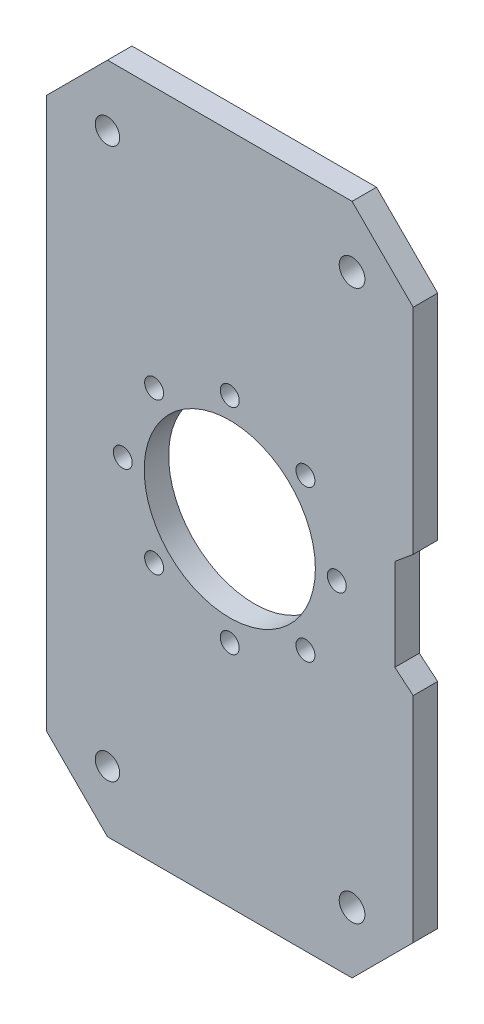
ISO-10303-21;
HEADER;
FILE_DESCRIPTION(('STEP AP214'),'2;1');
FILE_NAME('part.step','',(''),(''),'','','');
FILE_SCHEMA(('AUTOMOTIVE_DESIGN { 1 0 10303 214 1 1 1 1 }'));
ENDSEC;
DATA;
#1=APPLICATION_CONTEXT('core data for automotive mechanical design processes');
#2=APPLICATION_PROTOCOL_DEFINITION('international standard','automotive_design',2000,#1);
#3=PRODUCT_CONTEXT('',#1,'mechanical');
#4=PRODUCT('Part','Part','',(#3));
#5=PRODUCT_RELATED_PRODUCT_CATEGORY('part','',(#4));
#6=PRODUCT_DEFINITION_FORMATION('','',#4);
#7=PRODUCT_DEFINITION_CONTEXT('part definition',#1,'design');
#8=PRODUCT_DEFINITION('design','',#6,#7);
#9=PRODUCT_DEFINITION_SHAPE('','',#8);
#10=(LENGTH_UNIT() NAMED_UNIT(*) SI_UNIT(.MILLI.,.METRE.));
#11=(NAMED_UNIT(*) PLANE_ANGLE_UNIT() SI_UNIT($,.RADIAN.));
#12=(NAMED_UNIT(*) SI_UNIT($,.STERADIAN.) SOLID_ANGLE_UNIT());
#13=UNCERTAINTY_MEASURE_WITH_UNIT(LENGTH_MEASURE(1.E-05),#10,'distance_accuracy_value','');
#14=(GEOMETRIC_REPRESENTATION_CONTEXT(3) GLOBAL_UNCERTAINTY_ASSIGNED_CONTEXT((#13)) GLOBAL_UNIT_ASSIGNED_CONTEXT((#10,
#11,#12)) REPRESENTATION_CONTEXT('',''));
#15=CARTESIAN_POINT('',(0.,0.,0.));
#16=DIRECTION('',(0.,0.,1.));
#17=DIRECTION('',(1.,0.,0.));
#18=AXIS2_PLACEMENT_3D('',#15,#16,#17);
#19=CARTESIAN_POINT('',(30.,-55.,2.));
#20=DIRECTION('',(-1.,0.,0.));
#21=DIRECTION('',(0.,0.,1.));
#22=AXIS2_PLACEMENT_3D('',#19,#20,#21);
#23=PLANE('',#22);
#24=DIRECTION('',(0.,1.,0.));
#25=VECTOR('',#24,1.);
#26=CARTESIAN_POINT('',(30.,-55.,2.));
#27=LINE('',#26,#25);
#28=CARTESIAN_POINT('',(30.,10.,2.));
#29=VERTEX_POINT('',#28);
#30=CARTESIAN_POINT('',(30.,45.,2.));
#31=VERTEX_POINT('',#30);
#32=EDGE_CURVE('E249',#29,#31,#27,.T.);
#33=ORIENTED_EDGE('',*,*,#32,.F.);
#34=DIRECTION('',(0.,0.,-1.));
#35=VECTOR('',#34,1.);
#36=CARTESIAN_POINT('',(30.,10.,2.));
#37=LINE('',#36,#35);
#38=CARTESIAN_POINT('',(30.,10.,-2.));
#39=VERTEX_POINT('',#38);
#40=EDGE_CURVE('E158',#29,#39,#37,.T.);
#41=ORIENTED_EDGE('',*,*,#40,.T.);
#42=DIRECTION('',(0.,1.,0.));
#43=VECTOR('',#42,1.);
#44=CARTESIAN_POINT('',(30.,-55.,-2.));
#45=LINE('',#44,#43);
#46=CARTESIAN_POINT('',(30.,45.,-2.));
#47=VERTEX_POINT('',#46);
#48=EDGE_CURVE('E259',#39,#47,#45,.T.);
#49=ORIENTED_EDGE('',*,*,#48,.T.);
#50=DIRECTION('',(0.,0.,1.));
#51=VECTOR('',#50,1.);
#52=CARTESIAN_POINT('',(30.,45.,2.));
#53=LINE('',#52,#51);
#54=EDGE_CURVE('E290',#47,#31,#53,.T.);
#55=ORIENTED_EDGE('',*,*,#54,.T.);
#56=EDGE_LOOP('',(#33,#41,#49,#55));
#57=FACE_BOUND('',#56,.T.);
#58=ADVANCED_FACE('F37',(#57),#23,.F.);
#59=CARTESIAN_POINT('',(0.,0.,2.));
#60=DIRECTION('',(0.,0.,1.));
#61=DIRECTION('',(1.,0.,0.));
#62=AXIS2_PLACEMENT_3D('',#59,#60,#61);
#63=PLANE('',#62);
#64=DIRECTION('',(0.768221279597375,0.64018439966448,0.));
#65=VECTOR('',#64,1.);
#66=CARTESIAN_POINT('',(27.,7.5,2.));
#67=LINE('',#66,#65);
#68=CARTESIAN_POINT('',(27.,7.5,2.));
#69=VERTEX_POINT('',#68);
#70=EDGE_CURVE('E143',#69,#29,#67,.T.);
#71=ORIENTED_EDGE('',*,*,#70,.T.);
#72=ORIENTED_EDGE('',*,*,#32,.T.);
#73=DIRECTION('',(0.707106781186547,-0.707106781186549,0.));
#74=VECTOR('',#73,1.);
#75=CARTESIAN_POINT('',(37.5,37.4999999999999,2.));
#76=LINE('',#75,#74);
#77=CARTESIAN_POINT('',(20.,55.,2.));
#78=VERTEX_POINT('',#77);
#79=EDGE_CURVE('E284',#31,#78,#76,.F.);
#80=ORIENTED_EDGE('',*,*,#79,.T.);
#81=DIRECTION('',(-1.,0.,0.));
#82=VECTOR('',#81,1.);
#83=CARTESIAN_POINT('',(30.,55.,2.));
#84=LINE('',#83,#82);
#85=CARTESIAN_POINT('',(-20.,55.,2.));
#86=VERTEX_POINT('',#85);
#87=EDGE_CURVE('E251',#78,#86,#84,.T.);
#88=ORIENTED_EDGE('',*,*,#87,.T.);
#89=DIRECTION('',(0.707106781186549,0.707106781186547,0.));
#90=VECTOR('',#89,1.);
#91=CARTESIAN_POINT('',(-37.5,37.5000000000001,2.));
#92=LINE('',#91,#90);
#93=CARTESIAN_POINT('',(-30.,45.,2.));
#94=VERTEX_POINT('',#93);
#95=EDGE_CURVE('E282',#86,#94,#92,.F.);
#96=ORIENTED_EDGE('',*,*,#95,.T.);
#97=DIRECTION('',(0.,-1.,0.));
#98=VECTOR('',#97,1.);
#99=CARTESIAN_POINT('',(-30.,-55.,2.));
#100=LINE('',#99,#98);
#101=CARTESIAN_POINT('',(-30.,-45.,2.));
#102=VERTEX_POINT('',#101);
#103=EDGE_CURVE('E242',#94,#102,#100,.T.);
#104=ORIENTED_EDGE('',*,*,#103,.T.);
#105=DIRECTION('',(-0.707106781186547,0.707106781186549,0.));
#106=VECTOR('',#105,1.);
#107=CARTESIAN_POINT('',(-37.5,-37.4999999999999,2.));
#108=LINE('',#107,#106);
#109=CARTESIAN_POINT('',(-20.,-55.,2.));
#110=VERTEX_POINT('',#109);
#111=EDGE_CURVE('E288',#102,#110,#108,.F.);
#112=ORIENTED_EDGE('',*,*,#111,.T.);
#113=DIRECTION('',(1.,0.,0.));
#114=VECTOR('',#113,1.);
#115=CARTESIAN_POINT('',(30.,-55.,2.));
#116=LINE('',#115,#114);
#117=CARTESIAN_POINT('',(20.,-55.,2.));
#118=VERTEX_POINT('',#117);
#119=EDGE_CURVE('E245',#110,#118,#116,.T.);
#120=ORIENTED_EDGE('',*,*,#119,.T.);
#121=DIRECTION('',(-0.707106781186549,-0.707106781186547,0.));
#122=VECTOR('',#121,1.);
#123=CARTESIAN_POINT('',(37.5,-37.5000000000001,2.));
#124=LINE('',#123,#122);
#125=CARTESIAN_POINT('',(30.,-45.,2.));
#126=VERTEX_POINT('',#125);
#127=EDGE_CURVE('E286',#118,#126,#124,.F.);
#128=ORIENTED_EDGE('',*,*,#127,.T.);
#129=CARTESIAN_POINT('',(30.,-10.,2.));
#130=VERTEX_POINT('',#129);
#131=EDGE_CURVE('E149',#126,#130,#27,.T.);
#132=ORIENTED_EDGE('',*,*,#131,.T.);
#133=DIRECTION('',(-0.768221279597375,0.64018439966448,0.));
#134=VECTOR('',#133,1.);
#135=CARTESIAN_POINT('',(30.,-10.,2.));
#136=LINE('',#135,#134);
#137=CARTESIAN_POINT('',(27.,-7.5,2.));
#138=VERTEX_POINT('',#137);
#139=EDGE_CURVE('E53',#130,#138,#136,.T.);
#140=ORIENTED_EDGE('',*,*,#139,.T.);
#141=DIRECTION('',(0.,1.,0.));
#142=VECTOR('',#141,1.);
#143=CARTESIAN_POINT('',(27.,-7.5,2.));
#144=LINE('',#143,#142);
#145=EDGE_CURVE('E138',#138,#69,#144,.T.);
#146=ORIENTED_EDGE('',*,*,#145,.T.);
#147=EDGE_LOOP('',(#71,#72,#80,#88,#96,#104,#112,#120,#128,#132,#140,#146));
#148=FACE_BOUND('',#147,.T.);
#149=CARTESIAN_POINT('',(-17.5,0.,2.));
#150=DIRECTION('',(0.,0.,1.));
#151=DIRECTION('',(1.,0.,0.));
#152=AXIS2_PLACEMENT_3D('',#149,#150,#151);
#153=CIRCLE('',#152,1.55);
#154=CARTESIAN_POINT('',(-15.95,0.,2.));
#155=VERTEX_POINT('',#154);
#156=EDGE_CURVE('E170',#155,#155,#153,.T.);
#157=ORIENTED_EDGE('',*,*,#156,.F.);
#158=EDGE_LOOP('',(#157));
#159=FACE_BOUND('',#158,.T.);
#160=CARTESIAN_POINT('',(0.,-17.5,2.));
#161=DIRECTION('',(0.,0.,1.));
#162=DIRECTION('',(1.,0.,0.));
#163=AXIS2_PLACEMENT_3D('',#160,#161,#162);
#164=CIRCLE('',#163,1.55);
#165=CARTESIAN_POINT('',(1.55,-17.5,2.));
#166=VERTEX_POINT('',#165);
#167=EDGE_CURVE('E182',#166,#166,#164,.T.);
#168=ORIENTED_EDGE('',*,*,#167,.F.);
#169=EDGE_LOOP('',(#168));
#170=FACE_BOUND('',#169,.T.);
#171=CARTESIAN_POINT('',(17.5,0.,2.));
#172=DIRECTION('',(0.,0.,1.));
#173=DIRECTION('',(1.,0.,0.));
#174=AXIS2_PLACEMENT_3D('',#171,#172,#173);
#175=CIRCLE('',#174,1.55);
#176=CARTESIAN_POINT('',(19.05,0.,2.));
#177=VERTEX_POINT('',#176);
#178=EDGE_CURVE('E194',#177,#177,#175,.T.);
#179=ORIENTED_EDGE('',*,*,#178,.F.);
#180=EDGE_LOOP('',(#179));
#181=FACE_BOUND('',#180,.T.);
#182=CARTESIAN_POINT('',(0.,17.5,2.));
#183=DIRECTION('',(0.,0.,1.));
#184=DIRECTION('',(1.,0.,0.));
#185=AXIS2_PLACEMENT_3D('',#182,#183,#184);
#186=CIRCLE('',#185,1.55);
#187=CARTESIAN_POINT('',(1.55,17.5,2.));
#188=VERTEX_POINT('',#187);
#189=EDGE_CURVE('E206',#188,#188,#186,.T.);
#190=ORIENTED_EDGE('',*,*,#189,.F.);
#191=EDGE_LOOP('',(#190));
#192=FACE_BOUND('',#191,.T.);
#193=CARTESIAN_POINT('',(-20.,-45.,2.));
#194=DIRECTION('',(0.,0.,1.));
#195=DIRECTION('',(1.,0.,0.));
#196=AXIS2_PLACEMENT_3D('',#193,#194,#195);
#197=CIRCLE('',#196,2.);
#198=CARTESIAN_POINT('',(-18.,-45.,2.));
#199=VERTEX_POINT('',#198);
#200=EDGE_CURVE('E218',#199,#199,#197,.T.);
#201=ORIENTED_EDGE('',*,*,#200,.F.);
#202=EDGE_LOOP('',(#201));
#203=FACE_BOUND('',#202,.T.);
#204=CARTESIAN_POINT('',(-20.,45.,2.));
#205=DIRECTION('',(0.,0.,1.));
#206=DIRECTION('',(1.,0.,0.));
#207=AXIS2_PLACEMENT_3D('',#204,#205,#206);
#208=CIRCLE('',#207,2.);
#209=CARTESIAN_POINT('',(-18.,45.,2.));
#210=VERTEX_POINT('',#209);
#211=EDGE_CURVE('E230',#210,#210,#208,.T.);
#212=ORIENTED_EDGE('',*,*,#211,.F.);
#213=EDGE_LOOP('',(#212));
#214=FACE_BOUND('',#213,.T.);
#215=CARTESIAN_POINT('',(0.,0.,2.));
#216=DIRECTION('',(0.,0.,1.));
#217=DIRECTION('',(1.,0.,0.));
#218=AXIS2_PLACEMENT_3D('',#215,#216,#217);
#219=CIRCLE('',#218,14.);
#220=CARTESIAN_POINT('',(14.,0.,2.));
#221=VERTEX_POINT('',#220);
#222=EDGE_CURVE('E236',#221,#221,#219,.T.);
#223=ORIENTED_EDGE('',*,*,#222,.F.);
#224=EDGE_LOOP('',(#223));
#225=FACE_BOUND('',#224,.T.);
#226=CARTESIAN_POINT('',(20.,45.,2.));
#227=DIRECTION('',(0.,0.,1.));
#228=DIRECTION('',(1.,0.,0.));
#229=AXIS2_PLACEMENT_3D('',#226,#227,#228);
#230=CIRCLE('',#229,2.1);
#231=CARTESIAN_POINT('',(22.1,45.,2.));
#232=VERTEX_POINT('',#231);
#233=EDGE_CURVE('E224',#232,#232,#230,.T.);
#234=ORIENTED_EDGE('',*,*,#233,.F.);
#235=EDGE_LOOP('',(#234));
#236=FACE_BOUND('',#235,.T.);
#237=CARTESIAN_POINT('',(20.,-45.,2.));
#238=DIRECTION('',(0.,0.,1.));
#239=DIRECTION('',(1.,0.,0.));
#240=AXIS2_PLACEMENT_3D('',#237,#238,#239);
#241=CIRCLE('',#240,2.1);
#242=CARTESIAN_POINT('',(22.1,-45.,2.));
#243=VERTEX_POINT('',#242);
#244=EDGE_CURVE('E212',#243,#243,#241,.T.);
#245=ORIENTED_EDGE('',*,*,#244,.F.);
#246=EDGE_LOOP('',(#245));
#247=FACE_BOUND('',#246,.T.);
#248=CARTESIAN_POINT('',(12.3743686707646,12.3743686707646,2.));
#249=DIRECTION('',(0.,0.,1.));
#250=DIRECTION('',(1.,0.,0.));
#251=AXIS2_PLACEMENT_3D('',#248,#249,#250);
#252=CIRCLE('',#251,1.55);
#253=CARTESIAN_POINT('',(13.9243686707646,12.3743686707646,2.));
#254=VERTEX_POINT('',#253);
#255=EDGE_CURVE('E200',#254,#254,#252,.T.);
#256=ORIENTED_EDGE('',*,*,#255,.F.);
#257=EDGE_LOOP('',(#256));
#258=FACE_BOUND('',#257,.T.);
#259=CARTESIAN_POINT('',(12.3743686707646,-12.3743686707646,2.));
#260=DIRECTION('',(0.,0.,1.));
#261=DIRECTION('',(1.,0.,0.));
#262=AXIS2_PLACEMENT_3D('',#259,#260,#261);
#263=CIRCLE('',#262,1.55);
#264=CARTESIAN_POINT('',(13.9243686707646,-12.3743686707646,2.));
#265=VERTEX_POINT('',#264);
#266=EDGE_CURVE('E188',#265,#265,#263,.T.);
#267=ORIENTED_EDGE('',*,*,#266,.F.);
#268=EDGE_LOOP('',(#267));
#269=FACE_BOUND('',#268,.T.);
#270=CARTESIAN_POINT('',(-12.3743686707646,-12.3743686707646,2.));
#271=DIRECTION('',(0.,0.,1.));
#272=DIRECTION('',(1.,0.,0.));
#273=AXIS2_PLACEMENT_3D('',#270,#271,#272);
#274=CIRCLE('',#273,1.55);
#275=CARTESIAN_POINT('',(-10.8243686707646,-12.3743686707646,2.));
#276=VERTEX_POINT('',#275);
#277=EDGE_CURVE('E176',#276,#276,#274,.T.);
#278=ORIENTED_EDGE('',*,*,#277,.F.);
#279=EDGE_LOOP('',(#278));
#280=FACE_BOUND('',#279,.T.);
#281=CARTESIAN_POINT('',(-12.3743686707646,12.3743686707646,2.));
#282=DIRECTION('',(0.,0.,1.));
#283=DIRECTION('',(1.,0.,0.));
#284=AXIS2_PLACEMENT_3D('',#281,#282,#283);
#285=CIRCLE('',#284,1.55);
#286=CARTESIAN_POINT('',(-10.8243686707646,12.3743686707646,2.));
#287=VERTEX_POINT('',#286);
#288=EDGE_CURVE('E164',#287,#287,#285,.T.);
#289=ORIENTED_EDGE('',*,*,#288,.F.);
#290=EDGE_LOOP('',(#289));
#291=FACE_BOUND('',#290,.T.);
#292=ADVANCED_FACE('F146',(#148,#159,#170,#181,#192,#203,#214,#225,#236,#247,#258,#269,#280,
#291),#63,.T.);
#293=CARTESIAN_POINT('',(0.,0.,-2.));
#294=DIRECTION('',(0.,0.,1.));
#295=DIRECTION('',(1.,0.,0.));
#296=AXIS2_PLACEMENT_3D('',#293,#294,#295);
#297=PLANE('',#296);
#298=ORIENTED_EDGE('',*,*,#48,.F.);
#299=DIRECTION('',(0.768221279597375,0.64018439966448,0.));
#300=VECTOR('',#299,1.);
#301=CARTESIAN_POINT('',(27.,7.5,-2.));
#302=LINE('',#301,#300);
#303=CARTESIAN_POINT('',(27.,7.5,-2.));
#304=VERTEX_POINT('',#303);
#305=EDGE_CURVE('E150',#304,#39,#302,.T.);
#306=ORIENTED_EDGE('',*,*,#305,.F.);
#307=DIRECTION('',(0.,1.,0.));
#308=VECTOR('',#307,1.);
#309=CARTESIAN_POINT('',(27.,-7.5,-2.));
#310=LINE('',#309,#308);
#311=CARTESIAN_POINT('',(27.,-7.5,-2.));
#312=VERTEX_POINT('',#311);
#313=EDGE_CURVE('E152',#312,#304,#310,.T.);
#314=ORIENTED_EDGE('',*,*,#313,.F.);
#315=DIRECTION('',(-0.768221279597375,0.64018439966448,0.));
#316=VECTOR('',#315,1.);
#317=CARTESIAN_POINT('',(30.,-10.,-2.));
#318=LINE('',#317,#316);
#319=CARTESIAN_POINT('',(30.,-10.,-2.));
#320=VERTEX_POINT('',#319);
#321=EDGE_CURVE('E130',#320,#312,#318,.T.);
#322=ORIENTED_EDGE('',*,*,#321,.F.);
#323=CARTESIAN_POINT('',(30.,-45.,-2.));
#324=VERTEX_POINT('',#323);
#325=EDGE_CURVE('E260',#324,#320,#45,.T.);
#326=ORIENTED_EDGE('',*,*,#325,.F.);
#327=DIRECTION('',(0.707106781186549,0.707106781186547,0.));
#328=VECTOR('',#327,1.);
#329=CARTESIAN_POINT('',(30.,-45.,-2.));
#330=LINE('',#329,#328);
#331=CARTESIAN_POINT('',(20.,-55.,-2.));
#332=VERTEX_POINT('',#331);
#333=EDGE_CURVE('E273',#324,#332,#330,.F.);
#334=ORIENTED_EDGE('',*,*,#333,.T.);
#335=DIRECTION('',(1.,0.,0.));
#336=VECTOR('',#335,1.);
#337=CARTESIAN_POINT('',(30.,-55.,-2.));
#338=LINE('',#337,#336);
#339=CARTESIAN_POINT('',(-20.,-55.,-2.));
#340=VERTEX_POINT('',#339);
#341=EDGE_CURVE('E256',#340,#332,#338,.T.);
#342=ORIENTED_EDGE('',*,*,#341,.F.);
#343=DIRECTION('',(0.707106781186547,-0.707106781186549,0.));
#344=VECTOR('',#343,1.);
#345=CARTESIAN_POINT('',(-20.,-55.,-2.));
#346=LINE('',#345,#344);
#347=CARTESIAN_POINT('',(-30.,-45.,-2.));
#348=VERTEX_POINT('',#347);
#349=EDGE_CURVE('E275',#340,#348,#346,.F.);
#350=ORIENTED_EDGE('',*,*,#349,.T.);
#351=DIRECTION('',(0.,-1.,0.));
#352=VECTOR('',#351,1.);
#353=CARTESIAN_POINT('',(-30.,-55.,-2.));
#354=LINE('',#353,#352);
#355=CARTESIAN_POINT('',(-30.,45.,-2.));
#356=VERTEX_POINT('',#355);
#357=EDGE_CURVE('E239',#356,#348,#354,.T.);
#358=ORIENTED_EDGE('',*,*,#357,.F.);
#359=DIRECTION('',(-0.707106781186549,-0.707106781186547,0.));
#360=VECTOR('',#359,1.);
#361=CARTESIAN_POINT('',(-30.,45.,-2.));
#362=LINE('',#361,#360);
#363=CARTESIAN_POINT('',(-20.,55.,-2.));
#364=VERTEX_POINT('',#363);
#365=EDGE_CURVE('E268',#356,#364,#362,.F.);
#366=ORIENTED_EDGE('',*,*,#365,.T.);
#367=DIRECTION('',(-1.,0.,0.));
#368=VECTOR('',#367,1.);
#369=CARTESIAN_POINT('',(30.,55.,-2.));
#370=LINE('',#369,#368);
#371=CARTESIAN_POINT('',(20.,55.,-2.));
#372=VERTEX_POINT('',#371);
#373=EDGE_CURVE('E246',#372,#364,#370,.T.);
#374=ORIENTED_EDGE('',*,*,#373,.F.);
#375=DIRECTION('',(-0.707106781186547,0.707106781186549,0.));
#376=VECTOR('',#375,1.);
#377=CARTESIAN_POINT('',(20.,55.,-2.));
#378=LINE('',#377,#376);
#379=EDGE_CURVE('E270',#372,#47,#378,.F.);
#380=ORIENTED_EDGE('',*,*,#379,.T.);
#381=EDGE_LOOP('',(#298,#306,#314,#322,#326,#334,#342,#350,#358,#366,#374,#380));
#382=FACE_BOUND('',#381,.T.);
#383=CARTESIAN_POINT('',(0.,0.,-2.));
#384=DIRECTION('',(0.,0.,1.));
#385=DIRECTION('',(1.,0.,0.));
#386=AXIS2_PLACEMENT_3D('',#383,#384,#385);
#387=CIRCLE('',#386,14.);
#388=CARTESIAN_POINT('',(14.,0.,-2.));
#389=VERTEX_POINT('',#388);
#390=EDGE_CURVE('E233',#389,#389,#387,.T.);
#391=ORIENTED_EDGE('',*,*,#390,.T.);
#392=EDGE_LOOP('',(#391));
#393=FACE_BOUND('',#392,.T.);
#394=CARTESIAN_POINT('',(-20.,45.,-2.));
#395=DIRECTION('',(0.,0.,1.));
#396=DIRECTION('',(1.,0.,0.));
#397=AXIS2_PLACEMENT_3D('',#394,#395,#396);
#398=CIRCLE('',#397,2.);
#399=CARTESIAN_POINT('',(-18.,45.,-2.));
#400=VERTEX_POINT('',#399);
#401=EDGE_CURVE('E227',#400,#400,#398,.T.);
#402=ORIENTED_EDGE('',*,*,#401,.T.);
#403=EDGE_LOOP('',(#402));
#404=FACE_BOUND('',#403,.T.);
#405=CARTESIAN_POINT('',(20.,45.,-2.));
#406=DIRECTION('',(0.,0.,1.));
#407=DIRECTION('',(1.,0.,0.));
#408=AXIS2_PLACEMENT_3D('',#405,#406,#407);
#409=CIRCLE('',#408,2.1);
#410=CARTESIAN_POINT('',(22.1,45.,-2.));
#411=VERTEX_POINT('',#410);
#412=EDGE_CURVE('E221',#411,#411,#409,.T.);
#413=ORIENTED_EDGE('',*,*,#412,.T.);
#414=EDGE_LOOP('',(#413));
#415=FACE_BOUND('',#414,.T.);
#416=CARTESIAN_POINT('',(-20.,-45.,-2.));
#417=DIRECTION('',(0.,0.,1.));
#418=DIRECTION('',(1.,0.,0.));
#419=AXIS2_PLACEMENT_3D('',#416,#417,#418);
#420=CIRCLE('',#419,2.);
#421=CARTESIAN_POINT('',(-18.,-45.,-2.));
#422=VERTEX_POINT('',#421);
#423=EDGE_CURVE('E215',#422,#422,#420,.T.);
#424=ORIENTED_EDGE('',*,*,#423,.T.);
#425=EDGE_LOOP('',(#424));
#426=FACE_BOUND('',#425,.T.);
#427=CARTESIAN_POINT('',(20.,-45.,-2.));
#428=DIRECTION('',(0.,0.,1.));
#429=DIRECTION('',(1.,0.,0.));
#430=AXIS2_PLACEMENT_3D('',#427,#428,#429);
#431=CIRCLE('',#430,2.1);
#432=CARTESIAN_POINT('',(22.1,-45.,-2.));
#433=VERTEX_POINT('',#432);
#434=EDGE_CURVE('E209',#433,#433,#431,.T.);
#435=ORIENTED_EDGE('',*,*,#434,.T.);
#436=EDGE_LOOP('',(#435));
#437=FACE_BOUND('',#436,.T.);
#438=CARTESIAN_POINT('',(0.,17.5,-2.));
#439=DIRECTION('',(0.,0.,1.));
#440=DIRECTION('',(1.,0.,0.));
#441=AXIS2_PLACEMENT_3D('',#438,#439,#440);
#442=CIRCLE('',#441,1.55);
#443=CARTESIAN_POINT('',(1.55,17.5,-2.));
#444=VERTEX_POINT('',#443);
#445=EDGE_CURVE('E203',#444,#444,#442,.T.);
#446=ORIENTED_EDGE('',*,*,#445,.T.);
#447=EDGE_LOOP('',(#446));
#448=FACE_BOUND('',#447,.T.);
#449=CARTESIAN_POINT('',(12.3743686707646,12.3743686707646,-2.));
#450=DIRECTION('',(0.,0.,1.));
#451=DIRECTION('',(1.,0.,0.));
#452=AXIS2_PLACEMENT_3D('',#449,#450,#451);
#453=CIRCLE('',#452,1.55);
#454=CARTESIAN_POINT('',(13.9243686707646,12.3743686707646,-2.));
#455=VERTEX_POINT('',#454);
#456=EDGE_CURVE('E197',#455,#455,#453,.T.);
#457=ORIENTED_EDGE('',*,*,#456,.T.);
#458=EDGE_LOOP('',(#457));
#459=FACE_BOUND('',#458,.T.);
#460=CARTESIAN_POINT('',(17.5,0.,-2.));
#461=DIRECTION('',(0.,0.,1.));
#462=DIRECTION('',(1.,0.,0.));
#463=AXIS2_PLACEMENT_3D('',#460,#461,#462);
#464=CIRCLE('',#463,1.55);
#465=CARTESIAN_POINT('',(19.05,0.,-2.));
#466=VERTEX_POINT('',#465);
#467=EDGE_CURVE('E191',#466,#466,#464,.T.);
#468=ORIENTED_EDGE('',*,*,#467,.T.);
#469=EDGE_LOOP('',(#468));
#470=FACE_BOUND('',#469,.T.);
#471=CARTESIAN_POINT('',(12.3743686707646,-12.3743686707646,-2.));
#472=DIRECTION('',(0.,0.,1.));
#473=DIRECTION('',(1.,0.,0.));
#474=AXIS2_PLACEMENT_3D('',#471,#472,#473);
#475=CIRCLE('',#474,1.55);
#476=CARTESIAN_POINT('',(13.9243686707646,-12.3743686707646,-2.));
#477=VERTEX_POINT('',#476);
#478=EDGE_CURVE('E185',#477,#477,#475,.T.);
#479=ORIENTED_EDGE('',*,*,#478,.T.);
#480=EDGE_LOOP('',(#479));
#481=FACE_BOUND('',#480,.T.);
#482=CARTESIAN_POINT('',(0.,-17.5,-2.));
#483=DIRECTION('',(0.,0.,1.));
#484=DIRECTION('',(1.,0.,0.));
#485=AXIS2_PLACEMENT_3D('',#482,#483,#484);
#486=CIRCLE('',#485,1.55);
#487=CARTESIAN_POINT('',(1.55,-17.5,-2.));
#488=VERTEX_POINT('',#487);
#489=EDGE_CURVE('E179',#488,#488,#486,.T.);
#490=ORIENTED_EDGE('',*,*,#489,.T.);
#491=EDGE_LOOP('',(#490));
#492=FACE_BOUND('',#491,.T.);
#493=CARTESIAN_POINT('',(-12.3743686707646,-12.3743686707646,-2.));
#494=DIRECTION('',(0.,0.,1.));
#495=DIRECTION('',(1.,0.,0.));
#496=AXIS2_PLACEMENT_3D('',#493,#494,#495);
#497=CIRCLE('',#496,1.55);
#498=CARTESIAN_POINT('',(-10.8243686707646,-12.3743686707646,-2.));
#499=VERTEX_POINT('',#498);
#500=EDGE_CURVE('E173',#499,#499,#497,.T.);
#501=ORIENTED_EDGE('',*,*,#500,.T.);
#502=EDGE_LOOP('',(#501));
#503=FACE_BOUND('',#502,.T.);
#504=CARTESIAN_POINT('',(-17.5,0.,-2.));
#505=DIRECTION('',(0.,0.,1.));
#506=DIRECTION('',(1.,0.,0.));
#507=AXIS2_PLACEMENT_3D('',#504,#505,#506);
#508=CIRCLE('',#507,1.55);
#509=CARTESIAN_POINT('',(-15.95,0.,-2.));
#510=VERTEX_POINT('',#509);
#511=EDGE_CURVE('E167',#510,#510,#508,.T.);
#512=ORIENTED_EDGE('',*,*,#511,.T.);
#513=EDGE_LOOP('',(#512));
#514=FACE_BOUND('',#513,.T.);
#515=CARTESIAN_POINT('',(-12.3743686707646,12.3743686707646,-2.));
#516=DIRECTION('',(0.,0.,1.));
#517=DIRECTION('',(1.,0.,0.));
#518=AXIS2_PLACEMENT_3D('',#515,#516,#517);
#519=CIRCLE('',#518,1.55);
#520=CARTESIAN_POINT('',(-10.8243686707646,12.3743686707646,-2.));
#521=VERTEX_POINT('',#520);
#522=EDGE_CURVE('E161',#521,#521,#519,.T.);
#523=ORIENTED_EDGE('',*,*,#522,.T.);
#524=EDGE_LOOP('',(#523));
#525=FACE_BOUND('',#524,.T.);
#526=ADVANCED_FACE('F303',(#382,#393,#404,#415,#426,#437,#448,#459,#470,#481,#492,#503,#514,
#525),#297,.F.);
#527=CARTESIAN_POINT('',(-30.,-55.,2.));
#528=DIRECTION('',(1.,0.,0.));
#529=DIRECTION('',(0.,0.,-1.));
#530=AXIS2_PLACEMENT_3D('',#527,#528,#529);
#531=PLANE('',#530);
#532=ORIENTED_EDGE('',*,*,#357,.T.);
#533=DIRECTION('',(0.,0.,1.));
#534=VECTOR('',#533,1.);
#535=CARTESIAN_POINT('',(-30.,-45.,2.));
#536=LINE('',#535,#534);
#537=EDGE_CURVE('E280',#348,#102,#536,.T.);
#538=ORIENTED_EDGE('',*,*,#537,.T.);
#539=ORIENTED_EDGE('',*,*,#103,.F.);
#540=DIRECTION('',(0.,0.,-1.));
#541=VECTOR('',#540,1.);
#542=CARTESIAN_POINT('',(-30.,45.,2.));
#543=LINE('',#542,#541);
#544=EDGE_CURVE('E277',#94,#356,#543,.T.);
#545=ORIENTED_EDGE('',*,*,#544,.T.);
#546=EDGE_LOOP('',(#532,#538,#539,#545));
#547=FACE_BOUND('',#546,.T.);
#548=ADVANCED_FACE('F325',(#547),#531,.F.);
#549=CARTESIAN_POINT('',(30.,-55.,2.));
#550=DIRECTION('',(0.,1.,0.));
#551=DIRECTION('',(0.,0.,1.));
#552=AXIS2_PLACEMENT_3D('',#549,#550,#551);
#553=PLANE('',#552);
#554=ORIENTED_EDGE('',*,*,#119,.F.);
#555=DIRECTION('',(0.,0.,-1.));
#556=VECTOR('',#555,1.);
#557=CARTESIAN_POINT('',(-20.,-55.,2.));
#558=LINE('',#557,#556);
#559=EDGE_CURVE('E265',#110,#340,#558,.T.);
#560=ORIENTED_EDGE('',*,*,#559,.T.);
#561=ORIENTED_EDGE('',*,*,#341,.T.);
#562=DIRECTION('',(0.,0.,1.));
#563=VECTOR('',#562,1.);
#564=CARTESIAN_POINT('',(20.,-55.,2.));
#565=LINE('',#564,#563);
#566=EDGE_CURVE('E253',#332,#118,#565,.T.);
#567=ORIENTED_EDGE('',*,*,#566,.T.);
#568=EDGE_LOOP('',(#554,#560,#561,#567));
#569=FACE_BOUND('',#568,.T.);
#570=ADVANCED_FACE('F332',(#569),#553,.F.);
#571=ORIENTED_EDGE('',*,*,#325,.T.);
#572=DIRECTION('',(0.,0.,-1.));
#573=VECTOR('',#572,1.);
#574=CARTESIAN_POINT('',(30.,-10.,2.));
#575=LINE('',#574,#573);
#576=EDGE_CURVE('E135',#130,#320,#575,.T.);
#577=ORIENTED_EDGE('',*,*,#576,.F.);
#578=ORIENTED_EDGE('',*,*,#131,.F.);
#579=DIRECTION('',(0.,0.,-1.));
#580=VECTOR('',#579,1.);
#581=CARTESIAN_POINT('',(30.,-45.,2.));
#582=LINE('',#581,#580);
#583=EDGE_CURVE('E293',#126,#324,#582,.T.);
#584=ORIENTED_EDGE('',*,*,#583,.T.);
#585=EDGE_LOOP('',(#571,#577,#578,#584));
#586=FACE_BOUND('',#585,.T.);
#587=ADVANCED_FACE('F298',(#586),#23,.F.);
#588=CARTESIAN_POINT('',(30.,55.,2.));
#589=DIRECTION('',(0.,-1.,0.));
#590=DIRECTION('',(0.,0.,-1.));
#591=AXIS2_PLACEMENT_3D('',#588,#589,#590);
#592=PLANE('',#591);
#593=ORIENTED_EDGE('',*,*,#87,.F.);
#594=DIRECTION('',(0.,0.,-1.));
#595=VECTOR('',#594,1.);
#596=CARTESIAN_POINT('',(20.,55.,2.));
#597=LINE('',#596,#595);
#598=EDGE_CURVE('E11',#78,#372,#597,.T.);
#599=ORIENTED_EDGE('',*,*,#598,.T.);
#600=ORIENTED_EDGE('',*,*,#373,.T.);
#601=DIRECTION('',(0.,0.,1.));
#602=VECTOR('',#601,1.);
#603=CARTESIAN_POINT('',(-20.,55.,2.));
#604=LINE('',#603,#602);
#605=EDGE_CURVE('E46',#364,#86,#604,.T.);
#606=ORIENTED_EDGE('',*,*,#605,.T.);
#607=EDGE_LOOP('',(#593,#599,#600,#606));
#608=FACE_BOUND('',#607,.T.);
#609=ADVANCED_FACE('F316',(#608),#592,.F.);
#610=CARTESIAN_POINT('',(0.,0.,2.));
#611=DIRECTION('',(0.,0.,-1.));
#612=DIRECTION('',(-1.,0.,0.));
#613=AXIS2_PLACEMENT_3D('',#610,#611,#612);
#614=CYLINDRICAL_SURFACE('',#613,14.);
#615=ORIENTED_EDGE('',*,*,#222,.T.);
#616=EDGE_LOOP('',(#615));
#617=FACE_BOUND('',#616,.T.);
#618=ORIENTED_EDGE('',*,*,#390,.F.);
#619=EDGE_LOOP('',(#618));
#620=FACE_BOUND('',#619,.T.);
#621=ADVANCED_FACE('F357',(#617,#620),#614,.F.);
#622=CARTESIAN_POINT('',(-20.,45.,2.));
#623=DIRECTION('',(0.,0.,-1.));
#624=DIRECTION('',(-1.,0.,0.));
#625=AXIS2_PLACEMENT_3D('',#622,#623,#624);
#626=CYLINDRICAL_SURFACE('',#625,2.);
#627=ORIENTED_EDGE('',*,*,#211,.T.);
#628=EDGE_LOOP('',(#627));
#629=FACE_BOUND('',#628,.T.);
#630=ORIENTED_EDGE('',*,*,#401,.F.);
#631=EDGE_LOOP('',(#630));
#632=FACE_BOUND('',#631,.T.);
#633=ADVANCED_FACE('F381',(#629,#632),#626,.F.);
#634=CARTESIAN_POINT('',(20.,45.,2.));
#635=DIRECTION('',(0.,0.,-1.));
#636=DIRECTION('',(-1.,0.,0.));
#637=AXIS2_PLACEMENT_3D('',#634,#635,#636);
#638=CYLINDRICAL_SURFACE('',#637,2.1);
#639=ORIENTED_EDGE('',*,*,#233,.T.);
#640=EDGE_LOOP('',(#639));
#641=FACE_BOUND('',#640,.T.);
#642=ORIENTED_EDGE('',*,*,#412,.F.);
#643=EDGE_LOOP('',(#642));
#644=FACE_BOUND('',#643,.T.);
#645=ADVANCED_FACE('F385',(#641,#644),#638,.F.);
#646=CARTESIAN_POINT('',(-20.,-45.,2.));
#647=DIRECTION('',(0.,0.,-1.));
#648=DIRECTION('',(-1.,0.,0.));
#649=AXIS2_PLACEMENT_3D('',#646,#647,#648);
#650=CYLINDRICAL_SURFACE('',#649,2.);
#651=ORIENTED_EDGE('',*,*,#200,.T.);
#652=EDGE_LOOP('',(#651));
#653=FACE_BOUND('',#652,.T.);
#654=ORIENTED_EDGE('',*,*,#423,.F.);
#655=EDGE_LOOP('',(#654));
#656=FACE_BOUND('',#655,.T.);
#657=ADVANCED_FACE('F389',(#653,#656),#650,.F.);
#658=CARTESIAN_POINT('',(20.,-45.,2.));
#659=DIRECTION('',(0.,0.,-1.));
#660=DIRECTION('',(-1.,0.,0.));
#661=AXIS2_PLACEMENT_3D('',#658,#659,#660);
#662=CYLINDRICAL_SURFACE('',#661,2.1);
#663=ORIENTED_EDGE('',*,*,#244,.T.);
#664=EDGE_LOOP('',(#663));
#665=FACE_BOUND('',#664,.T.);
#666=ORIENTED_EDGE('',*,*,#434,.F.);
#667=EDGE_LOOP('',(#666));
#668=FACE_BOUND('',#667,.T.);
#669=ADVANCED_FACE('F393',(#665,#668),#662,.F.);
#670=CARTESIAN_POINT('',(0.,17.5,2.));
#671=DIRECTION('',(0.,0.,-1.));
#672=DIRECTION('',(-1.,0.,0.));
#673=AXIS2_PLACEMENT_3D('',#670,#671,#672);
#674=CYLINDRICAL_SURFACE('',#673,1.55);
#675=ORIENTED_EDGE('',*,*,#189,.T.);
#676=EDGE_LOOP('',(#675));
#677=FACE_BOUND('',#676,.T.);
#678=ORIENTED_EDGE('',*,*,#445,.F.);
#679=EDGE_LOOP('',(#678));
#680=FACE_BOUND('',#679,.T.);
#681=ADVANCED_FACE('F397',(#677,#680),#674,.F.);
#682=CARTESIAN_POINT('',(12.3743686707646,12.3743686707646,2.));
#683=DIRECTION('',(0.,0.,-1.));
#684=DIRECTION('',(-1.,0.,0.));
#685=AXIS2_PLACEMENT_3D('',#682,#683,#684);
#686=CYLINDRICAL_SURFACE('',#685,1.55);
#687=ORIENTED_EDGE('',*,*,#255,.T.);
#688=EDGE_LOOP('',(#687));
#689=FACE_BOUND('',#688,.T.);
#690=ORIENTED_EDGE('',*,*,#456,.F.);
#691=EDGE_LOOP('',(#690));
#692=FACE_BOUND('',#691,.T.);
#693=ADVANCED_FACE('F401',(#689,#692),#686,.F.);
#694=CARTESIAN_POINT('',(17.5,0.,2.));
#695=DIRECTION('',(0.,0.,-1.));
#696=DIRECTION('',(-1.,0.,0.));
#697=AXIS2_PLACEMENT_3D('',#694,#695,#696);
#698=CYLINDRICAL_SURFACE('',#697,1.55);
#699=ORIENTED_EDGE('',*,*,#178,.T.);
#700=EDGE_LOOP('',(#699));
#701=FACE_BOUND('',#700,.T.);
#702=ORIENTED_EDGE('',*,*,#467,.F.);
#703=EDGE_LOOP('',(#702));
#704=FACE_BOUND('',#703,.T.);
#705=ADVANCED_FACE('F405',(#701,#704),#698,.F.);
#706=CARTESIAN_POINT('',(12.3743686707646,-12.3743686707646,2.));
#707=DIRECTION('',(0.,0.,-1.));
#708=DIRECTION('',(-1.,0.,0.));
#709=AXIS2_PLACEMENT_3D('',#706,#707,#708);
#710=CYLINDRICAL_SURFACE('',#709,1.55);
#711=ORIENTED_EDGE('',*,*,#266,.T.);
#712=EDGE_LOOP('',(#711));
#713=FACE_BOUND('',#712,.T.);
#714=ORIENTED_EDGE('',*,*,#478,.F.);
#715=EDGE_LOOP('',(#714));
#716=FACE_BOUND('',#715,.T.);
#717=ADVANCED_FACE('F409',(#713,#716),#710,.F.);
#718=CARTESIAN_POINT('',(0.,-17.5,2.));
#719=DIRECTION('',(0.,0.,-1.));
#720=DIRECTION('',(-1.,0.,0.));
#721=AXIS2_PLACEMENT_3D('',#718,#719,#720);
#722=CYLINDRICAL_SURFACE('',#721,1.55);
#723=ORIENTED_EDGE('',*,*,#167,.T.);
#724=EDGE_LOOP('',(#723));
#725=FACE_BOUND('',#724,.T.);
#726=ORIENTED_EDGE('',*,*,#489,.F.);
#727=EDGE_LOOP('',(#726));
#728=FACE_BOUND('',#727,.T.);
#729=ADVANCED_FACE('F413',(#725,#728),#722,.F.);
#730=CARTESIAN_POINT('',(-12.3743686707646,-12.3743686707646,2.));
#731=DIRECTION('',(0.,0.,-1.));
#732=DIRECTION('',(-1.,0.,0.));
#733=AXIS2_PLACEMENT_3D('',#730,#731,#732);
#734=CYLINDRICAL_SURFACE('',#733,1.55);
#735=ORIENTED_EDGE('',*,*,#277,.T.);
#736=EDGE_LOOP('',(#735));
#737=FACE_BOUND('',#736,.T.);
#738=ORIENTED_EDGE('',*,*,#500,.F.);
#739=EDGE_LOOP('',(#738));
#740=FACE_BOUND('',#739,.T.);
#741=ADVANCED_FACE('F417',(#737,#740),#734,.F.);
#742=CARTESIAN_POINT('',(-17.5,0.,2.));
#743=DIRECTION('',(0.,0.,-1.));
#744=DIRECTION('',(-1.,0.,0.));
#745=AXIS2_PLACEMENT_3D('',#742,#743,#744);
#746=CYLINDRICAL_SURFACE('',#745,1.55);
#747=ORIENTED_EDGE('',*,*,#156,.T.);
#748=EDGE_LOOP('',(#747));
#749=FACE_BOUND('',#748,.T.);
#750=ORIENTED_EDGE('',*,*,#511,.F.);
#751=EDGE_LOOP('',(#750));
#752=FACE_BOUND('',#751,.T.);
#753=ADVANCED_FACE('F421',(#749,#752),#746,.F.);
#754=CARTESIAN_POINT('',(-12.3743686707646,12.3743686707646,2.));
#755=DIRECTION('',(0.,0.,-1.));
#756=DIRECTION('',(-1.,0.,0.));
#757=AXIS2_PLACEMENT_3D('',#754,#755,#756);
#758=CYLINDRICAL_SURFACE('',#757,1.55);
#759=ORIENTED_EDGE('',*,*,#288,.T.);
#760=EDGE_LOOP('',(#759));
#761=FACE_BOUND('',#760,.T.);
#762=ORIENTED_EDGE('',*,*,#522,.F.);
#763=EDGE_LOOP('',(#762));
#764=FACE_BOUND('',#763,.T.);
#765=ADVANCED_FACE('F341',(#761,#764),#758,.F.);
#766=CARTESIAN_POINT('',(-20.,-55.,2.));
#767=DIRECTION('',(0.707106781186548,0.707106781186546,0.));
#768=DIRECTION('',(0.,0.,-1.));
#769=AXIS2_PLACEMENT_3D('',#766,#767,#768);
#770=PLANE('',#769);
#771=ORIENTED_EDGE('',*,*,#111,.F.);
#772=ORIENTED_EDGE('',*,*,#537,.F.);
#773=ORIENTED_EDGE('',*,*,#349,.F.);
#774=ORIENTED_EDGE('',*,*,#559,.F.);
#775=EDGE_LOOP('',(#771,#772,#773,#774));
#776=FACE_BOUND('',#775,.T.);
#777=ADVANCED_FACE('F328',(#776),#770,.F.);
#778=CARTESIAN_POINT('',(30.,-45.,2.));
#779=DIRECTION('',(-0.707106781186546,0.707106781186548,0.));
#780=DIRECTION('',(0.,0.,-1.));
#781=AXIS2_PLACEMENT_3D('',#778,#779,#780);
#782=PLANE('',#781);
#783=ORIENTED_EDGE('',*,*,#127,.F.);
#784=ORIENTED_EDGE('',*,*,#566,.F.);
#785=ORIENTED_EDGE('',*,*,#333,.F.);
#786=ORIENTED_EDGE('',*,*,#583,.F.);
#787=EDGE_LOOP('',(#783,#784,#785,#786));
#788=FACE_BOUND('',#787,.T.);
#789=ADVANCED_FACE('F334',(#788),#782,.F.);
#790=CARTESIAN_POINT('',(20.,55.,2.));
#791=DIRECTION('',(-0.707106781186548,-0.707106781186546,0.));
#792=DIRECTION('',(0.,0.,-1.));
#793=AXIS2_PLACEMENT_3D('',#790,#791,#792);
#794=PLANE('',#793);
#795=ORIENTED_EDGE('',*,*,#79,.F.);
#796=ORIENTED_EDGE('',*,*,#54,.F.);
#797=ORIENTED_EDGE('',*,*,#379,.F.);
#798=ORIENTED_EDGE('',*,*,#598,.F.);
#799=EDGE_LOOP('',(#795,#796,#797,#798));
#800=FACE_BOUND('',#799,.T.);
#801=ADVANCED_FACE('F318',(#800),#794,.F.);
#802=CARTESIAN_POINT('',(-30.,45.,2.));
#803=DIRECTION('',(0.707106781186546,-0.707106781186548,0.));
#804=DIRECTION('',(0.,0.,-1.));
#805=AXIS2_PLACEMENT_3D('',#802,#803,#804);
#806=PLANE('',#805);
#807=ORIENTED_EDGE('',*,*,#95,.F.);
#808=ORIENTED_EDGE('',*,*,#605,.F.);
#809=ORIENTED_EDGE('',*,*,#365,.F.);
#810=ORIENTED_EDGE('',*,*,#544,.F.);
#811=EDGE_LOOP('',(#807,#808,#809,#810));
#812=FACE_BOUND('',#811,.T.);
#813=ADVANCED_FACE('F40',(#812),#806,.F.);
#814=CARTESIAN_POINT('',(27.,7.5,2.));
#815=DIRECTION('',(-0.64018439966448,0.768221279597376,0.));
#816=DIRECTION('',(-0.768221279597376,-0.64018439966448,0.));
#817=AXIS2_PLACEMENT_3D('',#814,#815,#816);
#818=PLANE('',#817);
#819=ORIENTED_EDGE('',*,*,#305,.T.);
#820=ORIENTED_EDGE('',*,*,#40,.F.);
#821=ORIENTED_EDGE('',*,*,#70,.F.);
#822=DIRECTION('',(0.,0.,-1.));
#823=VECTOR('',#822,1.);
#824=CARTESIAN_POINT('',(27.,7.5,2.));
#825=LINE('',#824,#823);
#826=EDGE_CURVE('E134',#69,#304,#825,.T.);
#827=ORIENTED_EDGE('',*,*,#826,.T.);
#828=EDGE_LOOP('',(#819,#820,#821,#827));
#829=FACE_BOUND('',#828,.T.);
#830=ADVANCED_FACE('F308',(#829),#818,.F.);
#831=CARTESIAN_POINT('',(27.,-7.5,2.));
#832=DIRECTION('',(-1.,0.,0.));
#833=DIRECTION('',(0.,0.,1.));
#834=AXIS2_PLACEMENT_3D('',#831,#832,#833);
#835=PLANE('',#834);
#836=ORIENTED_EDGE('',*,*,#313,.T.);
#837=ORIENTED_EDGE('',*,*,#826,.F.);
#838=ORIENTED_EDGE('',*,*,#145,.F.);
#839=DIRECTION('',(0.,0.,-1.));
#840=VECTOR('',#839,1.);
#841=CARTESIAN_POINT('',(27.,-7.5,2.));
#842=LINE('',#841,#840);
#843=EDGE_CURVE('E126',#138,#312,#842,.T.);
#844=ORIENTED_EDGE('',*,*,#843,.T.);
#845=EDGE_LOOP('',(#836,#837,#838,#844));
#846=FACE_BOUND('',#845,.T.);
#847=ADVANCED_FACE('F139',(#846),#835,.F.);
#848=CARTESIAN_POINT('',(30.,-10.,2.));
#849=DIRECTION('',(-0.64018439966448,-0.768221279597376,0.));
#850=DIRECTION('',(0.768221279597376,-0.64018439966448,0.));
#851=AXIS2_PLACEMENT_3D('',#848,#849,#850);
#852=PLANE('',#851);
#853=ORIENTED_EDGE('',*,*,#321,.T.);
#854=ORIENTED_EDGE('',*,*,#843,.F.);
#855=ORIENTED_EDGE('',*,*,#139,.F.);
#856=ORIENTED_EDGE('',*,*,#576,.T.);
#857=EDGE_LOOP('',(#853,#854,#855,#856));
#858=FACE_BOUND('',#857,.T.);
#859=ADVANCED_FACE('F128',(#858),#852,.F.);
#860=CLOSED_SHELL('',(#58,#292,#526,#548,#570,#587,#609,#621,#633,#645,#657,#669,#681,#693,#705,
#717,#729,#741,#753,#765,#777,#789,#801,#813,#830,#847,#859));
#861=MANIFOLD_SOLID_BREP('B2',#860);
#862=ADVANCED_BREP_SHAPE_REPRESENTATION('',(#18,#861),#14);
#863=SHAPE_DEFINITION_REPRESENTATION(#9,#862);
ENDSEC;
END-ISO-10303-21;
